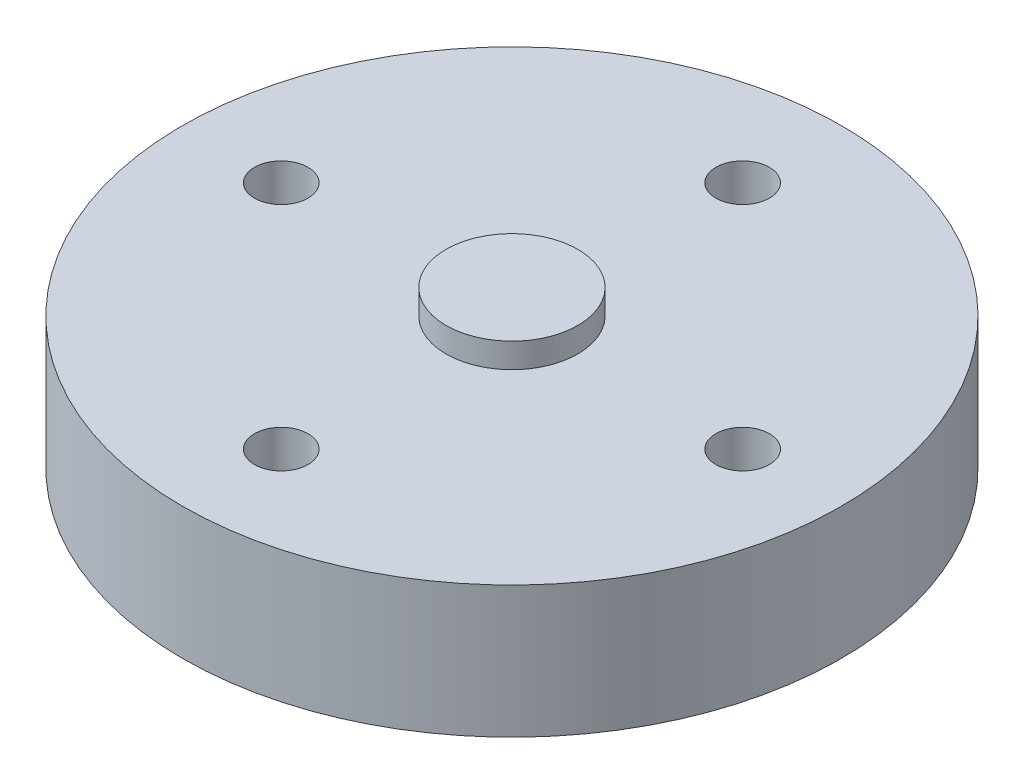
ISO-10303-21;
HEADER;
FILE_DESCRIPTION(('STEP AP214'),'2;1');
FILE_NAME('part.step','',(''),(''),'','','');
FILE_SCHEMA(('AUTOMOTIVE_DESIGN { 1 0 10303 214 1 1 1 1 }'));
ENDSEC;
DATA;
#1=APPLICATION_CONTEXT('core data for automotive mechanical design processes');
#2=APPLICATION_PROTOCOL_DEFINITION('international standard','automotive_design',2000,#1);
#3=PRODUCT_CONTEXT('',#1,'mechanical');
#4=PRODUCT('Part','Part','',(#3));
#5=PRODUCT_RELATED_PRODUCT_CATEGORY('part','',(#4));
#6=PRODUCT_DEFINITION_FORMATION('','',#4);
#7=PRODUCT_DEFINITION_CONTEXT('part definition',#1,'design');
#8=PRODUCT_DEFINITION('design','',#6,#7);
#9=PRODUCT_DEFINITION_SHAPE('','',#8);
#10=(LENGTH_UNIT() NAMED_UNIT(*) SI_UNIT(.MILLI.,.METRE.));
#11=(NAMED_UNIT(*) PLANE_ANGLE_UNIT() SI_UNIT($,.RADIAN.));
#12=(NAMED_UNIT(*) SI_UNIT($,.STERADIAN.) SOLID_ANGLE_UNIT());
#13=UNCERTAINTY_MEASURE_WITH_UNIT(LENGTH_MEASURE(1.E-05),#10,'distance_accuracy_value','');
#14=(GEOMETRIC_REPRESENTATION_CONTEXT(3) GLOBAL_UNCERTAINTY_ASSIGNED_CONTEXT((#13)) GLOBAL_UNIT_ASSIGNED_CONTEXT((#10,
#11,#12)) REPRESENTATION_CONTEXT('',''));
#15=CARTESIAN_POINT('',(0.,0.,0.));
#16=DIRECTION('',(0.,0.,1.));
#17=DIRECTION('',(1.,0.,0.));
#18=AXIS2_PLACEMENT_3D('',#15,#16,#17);
#19=CARTESIAN_POINT('',(0.,8.,0.));
#20=DIRECTION('',(0.,-1.,0.));
#21=DIRECTION('',(0.,0.,-1.));
#22=AXIS2_PLACEMENT_3D('',#19,#20,#21);
#23=CYLINDRICAL_SURFACE('',#22,20.);
#24=CARTESIAN_POINT('',(0.,8.,0.));
#25=DIRECTION('',(0.,1.,0.));
#26=DIRECTION('',(0.,0.,1.));
#27=AXIS2_PLACEMENT_3D('',#24,#25,#26);
#28=CIRCLE('',#27,20.);
#29=CARTESIAN_POINT('',(0.,8.,20.));
#30=VERTEX_POINT('',#29);
#31=EDGE_CURVE('E10',#30,#30,#28,.T.);
#32=ORIENTED_EDGE('',*,*,#31,.F.);
#33=EDGE_LOOP('',(#32));
#34=FACE_BOUND('',#33,.T.);
#35=CARTESIAN_POINT('',(0.,0.,0.));
#36=DIRECTION('',(0.,1.,0.));
#37=DIRECTION('',(0.,0.,1.));
#38=AXIS2_PLACEMENT_3D('',#35,#36,#37);
#39=CIRCLE('',#38,20.);
#40=CARTESIAN_POINT('',(0.,0.,20.));
#41=VERTEX_POINT('',#40);
#42=EDGE_CURVE('E33',#41,#41,#39,.T.);
#43=ORIENTED_EDGE('',*,*,#42,.T.);
#44=EDGE_LOOP('',(#43));
#45=FACE_BOUND('',#44,.T.);
#46=ADVANCED_FACE('F30',(#34,#45),#23,.T.);
#47=CARTESIAN_POINT('',(0.,8.,0.));
#48=DIRECTION('',(0.,1.,0.));
#49=DIRECTION('',(0.,0.,1.));
#50=AXIS2_PLACEMENT_3D('',#47,#48,#49);
#51=PLANE('',#50);
#52=CARTESIAN_POINT('',(0.,8.,-14.));
#53=DIRECTION('',(0.,1.,0.));
#54=DIRECTION('',(0.,0.,1.));
#55=AXIS2_PLACEMENT_3D('',#52,#53,#54);
#56=CIRCLE('',#55,1.625);
#57=CARTESIAN_POINT('',(0.,8.,-12.375));
#58=VERTEX_POINT('',#57);
#59=EDGE_CURVE('E51',#58,#58,#56,.T.);
#60=ORIENTED_EDGE('',*,*,#59,.F.);
#61=EDGE_LOOP('',(#60));
#62=FACE_BOUND('',#61,.T.);
#63=CARTESIAN_POINT('',(0.,8.,14.));
#64=DIRECTION('',(0.,1.,0.));
#65=DIRECTION('',(0.,0.,1.));
#66=AXIS2_PLACEMENT_3D('',#63,#64,#65);
#67=CIRCLE('',#66,1.625);
#68=CARTESIAN_POINT('',(0.,8.,15.625));
#69=VERTEX_POINT('',#68);
#70=EDGE_CURVE('E63',#69,#69,#67,.T.);
#71=ORIENTED_EDGE('',*,*,#70,.F.);
#72=EDGE_LOOP('',(#71));
#73=FACE_BOUND('',#72,.T.);
#74=CARTESIAN_POINT('',(-14.,8.,0.));
#75=DIRECTION('',(0.,1.,0.));
#76=DIRECTION('',(0.,0.,1.));
#77=AXIS2_PLACEMENT_3D('',#74,#75,#76);
#78=CIRCLE('',#77,1.625);
#79=CARTESIAN_POINT('',(-14.,8.,1.625));
#80=VERTEX_POINT('',#79);
#81=EDGE_CURVE('E57',#80,#80,#78,.T.);
#82=ORIENTED_EDGE('',*,*,#81,.F.);
#83=EDGE_LOOP('',(#82));
#84=FACE_BOUND('',#83,.T.);
#85=CARTESIAN_POINT('',(14.,8.,0.));
#86=DIRECTION('',(0.,1.,0.));
#87=DIRECTION('',(0.,0.,1.));
#88=AXIS2_PLACEMENT_3D('',#85,#86,#87);
#89=CIRCLE('',#88,1.625);
#90=CARTESIAN_POINT('',(14.,8.,1.625));
#91=VERTEX_POINT('',#90);
#92=EDGE_CURVE('E48',#91,#91,#89,.T.);
#93=ORIENTED_EDGE('',*,*,#92,.F.);
#94=EDGE_LOOP('',(#93));
#95=FACE_BOUND('',#94,.T.);
#96=CARTESIAN_POINT('',(0.,8.,0.));
#97=DIRECTION('',(0.,1.,0.));
#98=DIRECTION('',(0.,0.,1.));
#99=AXIS2_PLACEMENT_3D('',#96,#97,#98);
#100=CIRCLE('',#99,4.);
#101=CARTESIAN_POINT('',(0.,8.,4.));
#102=VERTEX_POINT('',#101);
#103=EDGE_CURVE('E42',#102,#102,#100,.T.);
#104=ORIENTED_EDGE('',*,*,#103,.F.);
#105=EDGE_LOOP('',(#104));
#106=FACE_BOUND('',#105,.T.);
#107=ORIENTED_EDGE('',*,*,#31,.T.);
#108=EDGE_LOOP('',(#107));
#109=FACE_BOUND('',#108,.T.);
#110=ADVANCED_FACE('F74',(#62,#73,#84,#95,#106,#109),#51,.T.);
#111=CARTESIAN_POINT('',(0.,0.,0.));
#112=DIRECTION('',(0.,1.,0.));
#113=DIRECTION('',(0.,0.,1.));
#114=AXIS2_PLACEMENT_3D('',#111,#112,#113);
#115=PLANE('',#114);
#116=CARTESIAN_POINT('',(0.,0.,-14.));
#117=DIRECTION('',(0.,1.,0.));
#118=DIRECTION('',(0.,0.,1.));
#119=AXIS2_PLACEMENT_3D('',#116,#117,#118);
#120=CIRCLE('',#119,1.625);
#121=CARTESIAN_POINT('',(0.,0.,-12.375));
#122=VERTEX_POINT('',#121);
#123=EDGE_CURVE('E66',#122,#122,#120,.T.);
#124=ORIENTED_EDGE('',*,*,#123,.T.);
#125=EDGE_LOOP('',(#124));
#126=FACE_BOUND('',#125,.T.);
#127=CARTESIAN_POINT('',(0.,0.,14.));
#128=DIRECTION('',(0.,1.,0.));
#129=DIRECTION('',(0.,0.,1.));
#130=AXIS2_PLACEMENT_3D('',#127,#128,#129);
#131=CIRCLE('',#130,1.625);
#132=CARTESIAN_POINT('',(0.,0.,15.625));
#133=VERTEX_POINT('',#132);
#134=EDGE_CURVE('E60',#133,#133,#131,.T.);
#135=ORIENTED_EDGE('',*,*,#134,.T.);
#136=EDGE_LOOP('',(#135));
#137=FACE_BOUND('',#136,.T.);
#138=CARTESIAN_POINT('',(-14.,0.,0.));
#139=DIRECTION('',(0.,1.,0.));
#140=DIRECTION('',(0.,0.,1.));
#141=AXIS2_PLACEMENT_3D('',#138,#139,#140);
#142=CIRCLE('',#141,1.625);
#143=CARTESIAN_POINT('',(-14.,0.,1.625));
#144=VERTEX_POINT('',#143);
#145=EDGE_CURVE('E54',#144,#144,#142,.T.);
#146=ORIENTED_EDGE('',*,*,#145,.T.);
#147=EDGE_LOOP('',(#146));
#148=FACE_BOUND('',#147,.T.);
#149=CARTESIAN_POINT('',(14.,0.,0.));
#150=DIRECTION('',(0.,1.,0.));
#151=DIRECTION('',(0.,0.,1.));
#152=AXIS2_PLACEMENT_3D('',#149,#150,#151);
#153=CIRCLE('',#152,1.625);
#154=CARTESIAN_POINT('',(14.,0.,1.625));
#155=VERTEX_POINT('',#154);
#156=EDGE_CURVE('E45',#155,#155,#153,.T.);
#157=ORIENTED_EDGE('',*,*,#156,.T.);
#158=EDGE_LOOP('',(#157));
#159=FACE_BOUND('',#158,.T.);
#160=ORIENTED_EDGE('',*,*,#42,.F.);
#161=EDGE_LOOP('',(#160));
#162=FACE_BOUND('',#161,.T.);
#163=ADVANCED_FACE('F77',(#126,#137,#148,#159,#162),#115,.F.);
#164=CARTESIAN_POINT('',(0.,9.5,0.));
#165=DIRECTION('',(0.,-1.,0.));
#166=DIRECTION('',(0.,0.,-1.));
#167=AXIS2_PLACEMENT_3D('',#164,#165,#166);
#168=CYLINDRICAL_SURFACE('',#167,4.);
#169=CARTESIAN_POINT('',(0.,9.5,0.));
#170=DIRECTION('',(0.,1.,0.));
#171=DIRECTION('',(0.,0.,1.));
#172=AXIS2_PLACEMENT_3D('',#169,#170,#171);
#173=CIRCLE('',#172,4.);
#174=CARTESIAN_POINT('',(0.,9.5,4.));
#175=VERTEX_POINT('',#174);
#176=EDGE_CURVE('E40',#175,#175,#173,.T.);
#177=ORIENTED_EDGE('',*,*,#176,.F.);
#178=EDGE_LOOP('',(#177));
#179=FACE_BOUND('',#178,.T.);
#180=ORIENTED_EDGE('',*,*,#103,.T.);
#181=EDGE_LOOP('',(#180));
#182=FACE_BOUND('',#181,.T.);
#183=ADVANCED_FACE('F87',(#179,#182),#168,.T.);
#184=CARTESIAN_POINT('',(0.,9.5,0.));
#185=DIRECTION('',(0.,1.,0.));
#186=DIRECTION('',(0.,0.,1.));
#187=AXIS2_PLACEMENT_3D('',#184,#185,#186);
#188=PLANE('',#187);
#189=ORIENTED_EDGE('',*,*,#176,.T.);
#190=EDGE_LOOP('',(#189));
#191=FACE_BOUND('',#190,.T.);
#192=ADVANCED_FACE('F89',(#191),#188,.T.);
#193=CARTESIAN_POINT('',(14.,0.,0.));
#194=DIRECTION('',(0.,1.,0.));
#195=DIRECTION('',(0.,0.,1.));
#196=AXIS2_PLACEMENT_3D('',#193,#194,#195);
#197=CYLINDRICAL_SURFACE('',#196,1.625);
#198=ORIENTED_EDGE('',*,*,#156,.F.);
#199=EDGE_LOOP('',(#198));
#200=FACE_BOUND('',#199,.T.);
#201=ORIENTED_EDGE('',*,*,#92,.T.);
#202=EDGE_LOOP('',(#201));
#203=FACE_BOUND('',#202,.T.);
#204=ADVANCED_FACE('F96',(#200,#203),#197,.F.);
#205=CARTESIAN_POINT('',(-14.,0.,0.));
#206=DIRECTION('',(0.,1.,0.));
#207=DIRECTION('',(0.,0.,1.));
#208=AXIS2_PLACEMENT_3D('',#205,#206,#207);
#209=CYLINDRICAL_SURFACE('',#208,1.625);
#210=ORIENTED_EDGE('',*,*,#145,.F.);
#211=EDGE_LOOP('',(#210));
#212=FACE_BOUND('',#211,.T.);
#213=ORIENTED_EDGE('',*,*,#81,.T.);
#214=EDGE_LOOP('',(#213));
#215=FACE_BOUND('',#214,.T.);
#216=ADVANCED_FACE('F127',(#212,#215),#209,.F.);
#217=CARTESIAN_POINT('',(0.,0.,14.));
#218=DIRECTION('',(0.,1.,0.));
#219=DIRECTION('',(0.,0.,1.));
#220=AXIS2_PLACEMENT_3D('',#217,#218,#219);
#221=CYLINDRICAL_SURFACE('',#220,1.625);
#222=ORIENTED_EDGE('',*,*,#134,.F.);
#223=EDGE_LOOP('',(#222));
#224=FACE_BOUND('',#223,.T.);
#225=ORIENTED_EDGE('',*,*,#70,.T.);
#226=EDGE_LOOP('',(#225));
#227=FACE_BOUND('',#226,.T.);
#228=ADVANCED_FACE('F138',(#224,#227),#221,.F.);
#229=CARTESIAN_POINT('',(0.,0.,-14.));
#230=DIRECTION('',(0.,1.,0.));
#231=DIRECTION('',(0.,0.,1.));
#232=AXIS2_PLACEMENT_3D('',#229,#230,#231);
#233=CYLINDRICAL_SURFACE('',#232,1.625);
#234=ORIENTED_EDGE('',*,*,#123,.F.);
#235=EDGE_LOOP('',(#234));
#236=FACE_BOUND('',#235,.T.);
#237=ORIENTED_EDGE('',*,*,#59,.T.);
#238=EDGE_LOOP('',(#237));
#239=FACE_BOUND('',#238,.T.);
#240=ADVANCED_FACE('F72',(#236,#239),#233,.F.);
#241=CLOSED_SHELL('',(#46,#110,#163,#183,#192,#204,#216,#228,#240));
#242=MANIFOLD_SOLID_BREP('B2',#241);
#243=ADVANCED_BREP_SHAPE_REPRESENTATION('',(#18,#242),#14);
#244=SHAPE_DEFINITION_REPRESENTATION(#9,#243);
ENDSEC;
END-ISO-10303-21;
